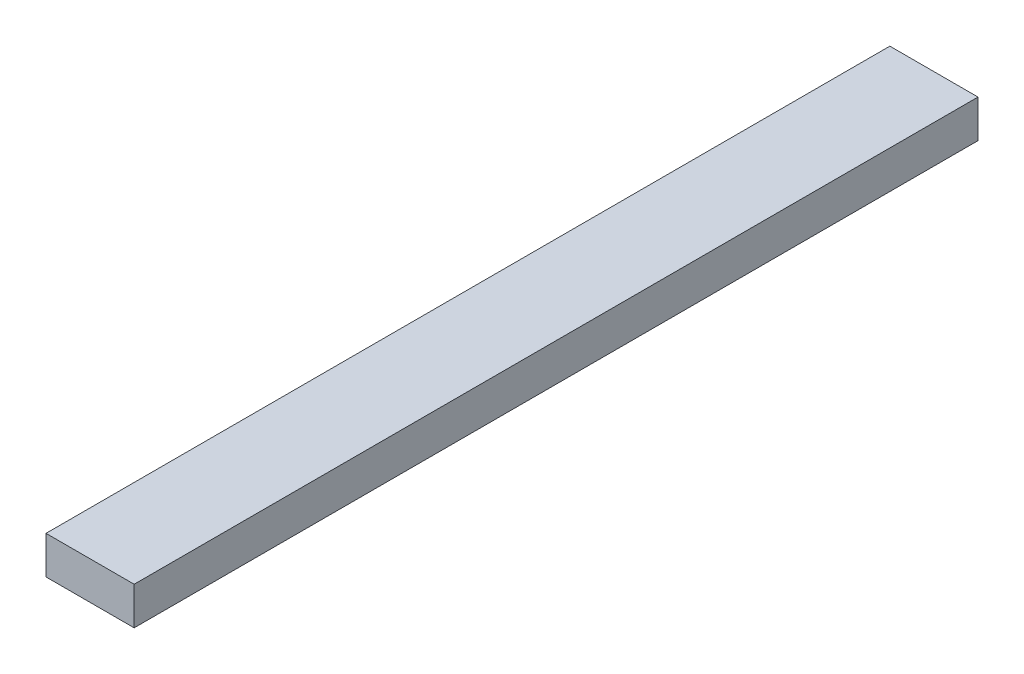
ISO-10303-21;
HEADER;
FILE_DESCRIPTION(('STEP AP214'),'2;1');
FILE_NAME('part.step','',(''),(''),'','','');
FILE_SCHEMA(('AUTOMOTIVE_DESIGN { 1 0 10303 214 1 1 1 1 }'));
ENDSEC;
DATA;
#1=APPLICATION_CONTEXT('core data for automotive mechanical design processes');
#2=APPLICATION_PROTOCOL_DEFINITION('international standard','automotive_design',2000,#1);
#3=PRODUCT_CONTEXT('',#1,'mechanical');
#4=PRODUCT('Part','Part','',(#3));
#5=PRODUCT_RELATED_PRODUCT_CATEGORY('part','',(#4));
#6=PRODUCT_DEFINITION_FORMATION('','',#4);
#7=PRODUCT_DEFINITION_CONTEXT('part definition',#1,'design');
#8=PRODUCT_DEFINITION('design','',#6,#7);
#9=PRODUCT_DEFINITION_SHAPE('','',#8);
#10=(LENGTH_UNIT() NAMED_UNIT(*) SI_UNIT(.MILLI.,.METRE.));
#11=(NAMED_UNIT(*) PLANE_ANGLE_UNIT() SI_UNIT($,.RADIAN.));
#12=(NAMED_UNIT(*) SI_UNIT($,.STERADIAN.) SOLID_ANGLE_UNIT());
#13=UNCERTAINTY_MEASURE_WITH_UNIT(LENGTH_MEASURE(1.E-05),#10,'distance_accuracy_value','');
#14=(GEOMETRIC_REPRESENTATION_CONTEXT(3) GLOBAL_UNCERTAINTY_ASSIGNED_CONTEXT((#13)) GLOBAL_UNIT_ASSIGNED_CONTEXT((#10,
#11,#12)) REPRESENTATION_CONTEXT('',''));
#15=CARTESIAN_POINT('',(0.,0.,0.));
#16=DIRECTION('',(0.,0.,1.));
#17=DIRECTION('',(1.,0.,0.));
#18=AXIS2_PLACEMENT_3D('',#15,#16,#17);
#19=CARTESIAN_POINT('',(0.,0.,850.9));
#20=DIRECTION('',(1.,0.,0.));
#21=DIRECTION('',(0.,0.,-1.));
#22=AXIS2_PLACEMENT_3D('',#19,#20,#21);
#23=PLANE('',#22);
#24=DIRECTION('',(0.,-1.,0.));
#25=VECTOR('',#24,1.);
#26=CARTESIAN_POINT('',(0.,0.,0.));
#27=LINE('',#26,#25);
#28=CARTESIAN_POINT('',(0.,38.1,0.));
#29=VERTEX_POINT('',#28);
#30=CARTESIAN_POINT('',(0.,0.,0.));
#31=VERTEX_POINT('',#30);
#32=EDGE_CURVE('E96',#29,#31,#27,.T.);
#33=ORIENTED_EDGE('',*,*,#32,.T.);
#34=DIRECTION('',(0.,0.,-1.));
#35=VECTOR('',#34,1.);
#36=CARTESIAN_POINT('',(0.,0.,850.9));
#37=LINE('',#36,#35);
#38=CARTESIAN_POINT('',(0.,0.,850.9));
#39=VERTEX_POINT('',#38);
#40=EDGE_CURVE('E11',#39,#31,#37,.T.);
#41=ORIENTED_EDGE('',*,*,#40,.F.);
#42=DIRECTION('',(0.,-1.,0.));
#43=VECTOR('',#42,1.);
#44=CARTESIAN_POINT('',(0.,0.,850.9));
#45=LINE('',#44,#43);
#46=CARTESIAN_POINT('',(0.,38.1,850.9));
#47=VERTEX_POINT('',#46);
#48=EDGE_CURVE('E84',#47,#39,#45,.T.);
#49=ORIENTED_EDGE('',*,*,#48,.F.);
#50=DIRECTION('',(0.,0.,-1.));
#51=VECTOR('',#50,1.);
#52=CARTESIAN_POINT('',(0.,38.1,850.9));
#53=LINE('',#52,#51);
#54=EDGE_CURVE('E92',#47,#29,#53,.T.);
#55=ORIENTED_EDGE('',*,*,#54,.T.);
#56=EDGE_LOOP('',(#33,#41,#49,#55));
#57=FACE_BOUND('',#56,.T.);
#58=ADVANCED_FACE('F33',(#57),#23,.F.);
#59=CARTESIAN_POINT('',(0.,0.,850.9));
#60=DIRECTION('',(0.,1.,0.));
#61=DIRECTION('',(0.,0.,1.));
#62=AXIS2_PLACEMENT_3D('',#59,#60,#61);
#63=PLANE('',#62);
#64=DIRECTION('',(1.,0.,0.));
#65=VECTOR('',#64,1.);
#66=CARTESIAN_POINT('',(0.,0.,0.));
#67=LINE('',#66,#65);
#68=CARTESIAN_POINT('',(88.9,0.,0.));
#69=VERTEX_POINT('',#68);
#70=EDGE_CURVE('E88',#31,#69,#67,.T.);
#71=ORIENTED_EDGE('',*,*,#70,.T.);
#72=DIRECTION('',(0.,0.,-1.));
#73=VECTOR('',#72,1.);
#74=CARTESIAN_POINT('',(88.9,0.,850.9));
#75=LINE('',#74,#73);
#76=CARTESIAN_POINT('',(88.9,0.,850.9));
#77=VERTEX_POINT('',#76);
#78=EDGE_CURVE('E41',#77,#69,#75,.T.);
#79=ORIENTED_EDGE('',*,*,#78,.F.);
#80=DIRECTION('',(1.,0.,0.));
#81=VECTOR('',#80,1.);
#82=CARTESIAN_POINT('',(0.,0.,850.9));
#83=LINE('',#82,#81);
#84=EDGE_CURVE('E79',#39,#77,#83,.T.);
#85=ORIENTED_EDGE('',*,*,#84,.F.);
#86=ORIENTED_EDGE('',*,*,#40,.T.);
#87=EDGE_LOOP('',(#71,#79,#85,#86));
#88=FACE_BOUND('',#87,.T.);
#89=ADVANCED_FACE('F87',(#88),#63,.F.);
#90=CARTESIAN_POINT('',(88.9,0.,850.9));
#91=DIRECTION('',(-1.,0.,0.));
#92=DIRECTION('',(0.,0.,1.));
#93=AXIS2_PLACEMENT_3D('',#90,#91,#92);
#94=PLANE('',#93);
#95=DIRECTION('',(0.,1.,0.));
#96=VECTOR('',#95,1.);
#97=CARTESIAN_POINT('',(88.9,0.,0.));
#98=LINE('',#97,#96);
#99=CARTESIAN_POINT('',(88.9,38.1,0.));
#100=VERTEX_POINT('',#99);
#101=EDGE_CURVE('E66',#69,#100,#98,.T.);
#102=ORIENTED_EDGE('',*,*,#101,.T.);
#103=DIRECTION('',(0.,0.,-1.));
#104=VECTOR('',#103,1.);
#105=CARTESIAN_POINT('',(88.9,38.1,850.9));
#106=LINE('',#105,#104);
#107=CARTESIAN_POINT('',(88.9,38.1,850.9));
#108=VERTEX_POINT('',#107);
#109=EDGE_CURVE('E89',#108,#100,#106,.T.);
#110=ORIENTED_EDGE('',*,*,#109,.F.);
#111=DIRECTION('',(0.,1.,0.));
#112=VECTOR('',#111,1.);
#113=CARTESIAN_POINT('',(88.9,0.,850.9));
#114=LINE('',#113,#112);
#115=EDGE_CURVE('E82',#77,#108,#114,.T.);
#116=ORIENTED_EDGE('',*,*,#115,.F.);
#117=ORIENTED_EDGE('',*,*,#78,.T.);
#118=EDGE_LOOP('',(#102,#110,#116,#117));
#119=FACE_BOUND('',#118,.T.);
#120=ADVANCED_FACE('F90',(#119),#94,.F.);
#121=CARTESIAN_POINT('',(0.,38.1,850.9));
#122=DIRECTION('',(0.,-1.,0.));
#123=DIRECTION('',(0.,0.,-1.));
#124=AXIS2_PLACEMENT_3D('',#121,#122,#123);
#125=PLANE('',#124);
#126=DIRECTION('',(-1.,0.,0.));
#127=VECTOR('',#126,1.);
#128=CARTESIAN_POINT('',(0.,38.1,0.));
#129=LINE('',#128,#127);
#130=EDGE_CURVE('E72',#100,#29,#129,.T.);
#131=ORIENTED_EDGE('',*,*,#130,.T.);
#132=ORIENTED_EDGE('',*,*,#54,.F.);
#133=DIRECTION('',(-1.,0.,0.));
#134=VECTOR('',#133,1.);
#135=CARTESIAN_POINT('',(0.,38.1,850.9));
#136=LINE('',#135,#134);
#137=EDGE_CURVE('E49',#108,#47,#136,.T.);
#138=ORIENTED_EDGE('',*,*,#137,.F.);
#139=ORIENTED_EDGE('',*,*,#109,.T.);
#140=EDGE_LOOP('',(#131,#132,#138,#139));
#141=FACE_BOUND('',#140,.T.);
#142=ADVANCED_FACE('F103',(#141),#125,.F.);
#143=CARTESIAN_POINT('',(0.,0.,850.9));
#144=DIRECTION('',(0.,0.,-1.));
#145=DIRECTION('',(-1.,0.,0.));
#146=AXIS2_PLACEMENT_3D('',#143,#144,#145);
#147=PLANE('',#146);
#148=ORIENTED_EDGE('',*,*,#48,.T.);
#149=ORIENTED_EDGE('',*,*,#84,.T.);
#150=ORIENTED_EDGE('',*,*,#115,.T.);
#151=ORIENTED_EDGE('',*,*,#137,.T.);
#152=EDGE_LOOP('',(#148,#149,#150,#151));
#153=FACE_BOUND('',#152,.T.);
#154=ADVANCED_FACE('F80',(#153),#147,.F.);
#155=CARTESIAN_POINT('',(0.,0.,0.));
#156=DIRECTION('',(0.,0.,-1.));
#157=DIRECTION('',(-1.,0.,0.));
#158=AXIS2_PLACEMENT_3D('',#155,#156,#157);
#159=PLANE('',#158);
#160=ORIENTED_EDGE('',*,*,#32,.F.);
#161=ORIENTED_EDGE('',*,*,#130,.F.);
#162=ORIENTED_EDGE('',*,*,#101,.F.);
#163=ORIENTED_EDGE('',*,*,#70,.F.);
#164=EDGE_LOOP('',(#160,#161,#162,#163));
#165=FACE_BOUND('',#164,.T.);
#166=ADVANCED_FACE('F106',(#165),#159,.T.);
#167=CLOSED_SHELL('',(#58,#89,#120,#142,#154,#166));
#168=MANIFOLD_SOLID_BREP('B2',#167);
#169=ADVANCED_BREP_SHAPE_REPRESENTATION('',(#18,#168),#14);
#170=SHAPE_DEFINITION_REPRESENTATION(#9,#169);
ENDSEC;
END-ISO-10303-21;
